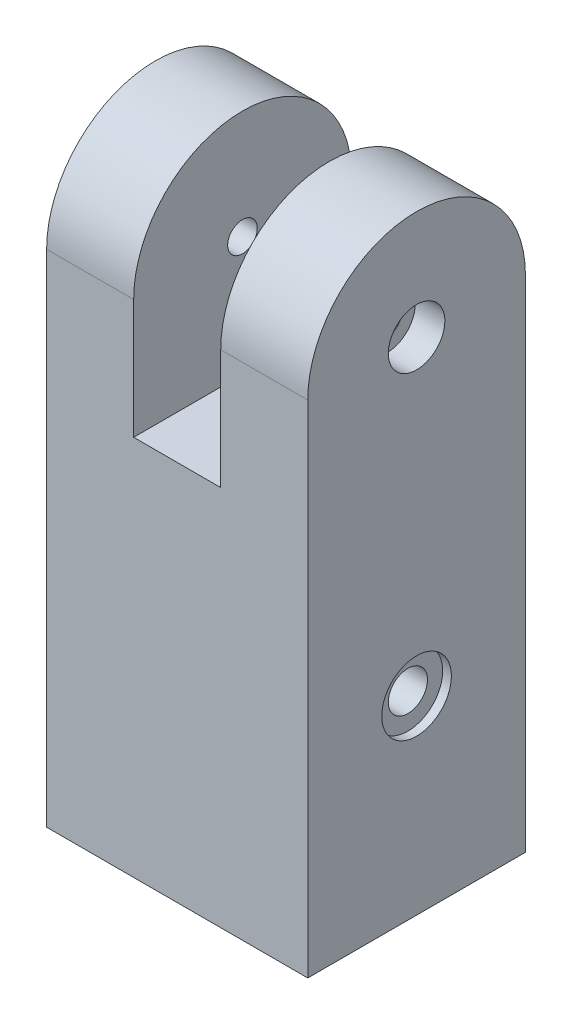
ISO-10303-21;
HEADER;
FILE_DESCRIPTION(('STEP AP214'),'2;1');
FILE_NAME('part.step','',(''),(''),'','','');
FILE_SCHEMA(('AUTOMOTIVE_DESIGN { 1 0 10303 214 1 1 1 1 }'));
ENDSEC;
DATA;
#1=APPLICATION_CONTEXT('core data for automotive mechanical design processes');
#2=APPLICATION_PROTOCOL_DEFINITION('international standard','automotive_design',2000,#1);
#3=PRODUCT_CONTEXT('',#1,'mechanical');
#4=PRODUCT('Part','Part','',(#3));
#5=PRODUCT_RELATED_PRODUCT_CATEGORY('part','',(#4));
#6=PRODUCT_DEFINITION_FORMATION('','',#4);
#7=PRODUCT_DEFINITION_CONTEXT('part definition',#1,'design');
#8=PRODUCT_DEFINITION('design','',#6,#7);
#9=PRODUCT_DEFINITION_SHAPE('','',#8);
#10=(LENGTH_UNIT() NAMED_UNIT(*) SI_UNIT(.MILLI.,.METRE.));
#11=(NAMED_UNIT(*) PLANE_ANGLE_UNIT() SI_UNIT($,.RADIAN.));
#12=(NAMED_UNIT(*) SI_UNIT($,.STERADIAN.) SOLID_ANGLE_UNIT());
#13=UNCERTAINTY_MEASURE_WITH_UNIT(LENGTH_MEASURE(1.E-05),#10,'distance_accuracy_value','');
#14=(GEOMETRIC_REPRESENTATION_CONTEXT(3) GLOBAL_UNCERTAINTY_ASSIGNED_CONTEXT((#13)) GLOBAL_UNIT_ASSIGNED_CONTEXT((#10,
#11,#12)) REPRESENTATION_CONTEXT('',''));
#15=CARTESIAN_POINT('',(0.,0.,0.));
#16=DIRECTION('',(0.,0.,1.));
#17=DIRECTION('',(1.,0.,0.));
#18=AXIS2_PLACEMENT_3D('',#15,#16,#17);
#19=CARTESIAN_POINT('',(15.,17.2001477134217,0.));
#20=DIRECTION('',(-1.,0.,0.));
#21=DIRECTION('',(0.,0.,1.));
#22=AXIS2_PLACEMENT_3D('',#19,#20,#21);
#23=CYLINDRICAL_SURFACE('',#22,12.5);
#24=DIRECTION('',(-1.,0.,0.));
#25=VECTOR('',#24,1.);
#26=CARTESIAN_POINT('',(15.,17.2001477134218,-12.5));
#27=LINE('',#26,#25);
#28=CARTESIAN_POINT('',(15.,17.2001477134218,-12.5));
#29=VERTEX_POINT('',#28);
#30=CARTESIAN_POINT('',(4.99999999999999,17.2001477134218,-12.5));
#31=VERTEX_POINT('',#30);
#32=EDGE_CURVE('E221',#29,#31,#27,.T.);
#33=ORIENTED_EDGE('',*,*,#32,.T.);
#34=CARTESIAN_POINT('',(4.99999999999999,17.2001477134217,0.));
#35=DIRECTION('',(1.,0.,0.));
#36=DIRECTION('',(0.,1.,0.));
#37=AXIS2_PLACEMENT_3D('',#34,#35,#36);
#38=CIRCLE('',#37,12.5);
#39=CARTESIAN_POINT('',(5.,17.2001477134217,12.5));
#40=VERTEX_POINT('',#39);
#41=EDGE_CURVE('E165',#40,#31,#38,.F.);
#42=ORIENTED_EDGE('',*,*,#41,.F.);
#43=DIRECTION('',(-1.,0.,0.));
#44=VECTOR('',#43,1.);
#45=CARTESIAN_POINT('',(15.,17.2001477134217,12.5));
#46=LINE('',#45,#44);
#47=CARTESIAN_POINT('',(15.,17.2001477134217,12.5));
#48=VERTEX_POINT('',#47);
#49=EDGE_CURVE('E12',#48,#40,#46,.T.);
#50=ORIENTED_EDGE('',*,*,#49,.F.);
#51=CARTESIAN_POINT('',(15.,17.2001477134217,0.));
#52=DIRECTION('',(1.,0.,0.));
#53=DIRECTION('',(0.,0.,1.));
#54=AXIS2_PLACEMENT_3D('',#51,#52,#53);
#55=CIRCLE('',#54,12.5);
#56=EDGE_CURVE('E202',#29,#48,#55,.T.);
#57=ORIENTED_EDGE('',*,*,#56,.F.);
#58=EDGE_LOOP('',(#33,#42,#50,#57));
#59=FACE_BOUND('',#58,.T.);
#60=ADVANCED_FACE('F38',(#59),#23,.T.);
#61=CARTESIAN_POINT('',(15.,17.2001477134217,0.));
#62=DIRECTION('',(1.,0.,0.));
#63=DIRECTION('',(0.,0.,-1.));
#64=AXIS2_PLACEMENT_3D('',#61,#62,#63);
#65=CYLINDRICAL_SURFACE('',#64,1.69999999999999);
#66=CARTESIAN_POINT('',(4.99999999999999,17.2001477134217,0.));
#67=DIRECTION('',(1.,0.,0.));
#68=DIRECTION('',(0.,1.,0.));
#69=AXIS2_PLACEMENT_3D('',#66,#67,#68);
#70=CIRCLE('',#69,1.69999999999999);
#71=CARTESIAN_POINT('',(4.99999999999999,18.9001477134217,0.));
#72=VERTEX_POINT('',#71);
#73=EDGE_CURVE('E172',#72,#72,#70,.T.);
#74=ORIENTED_EDGE('',*,*,#73,.F.);
#75=EDGE_LOOP('',(#74));
#76=FACE_BOUND('',#75,.T.);
#77=CARTESIAN_POINT('',(11.6,17.2001477134217,0.));
#78=DIRECTION('',(1.,0.,0.));
#79=DIRECTION('',(0.,0.,-1.));
#80=AXIS2_PLACEMENT_3D('',#77,#78,#79);
#81=CIRCLE('',#80,1.7);
#82=CARTESIAN_POINT('',(11.6,17.2001477134217,-1.7));
#83=VERTEX_POINT('',#82);
#84=EDGE_CURVE('E190',#83,#83,#81,.T.);
#85=ORIENTED_EDGE('',*,*,#84,.T.);
#86=EDGE_LOOP('',(#85));
#87=FACE_BOUND('',#86,.T.);
#88=ADVANCED_FACE('F281',(#76,#87),#65,.F.);
#89=CARTESIAN_POINT('',(-5.,17.2001477134217,12.5));
#90=VERTEX_POINT('',#89);
#91=CARTESIAN_POINT('',(-15.,17.2001477134217,12.5));
#92=VERTEX_POINT('',#91);
#93=EDGE_CURVE('E46',#90,#92,#46,.T.);
#94=ORIENTED_EDGE('',*,*,#93,.F.);
#95=CARTESIAN_POINT('',(-4.99999999999999,17.2001477134217,0.));
#96=DIRECTION('',(-1.,0.,0.));
#97=DIRECTION('',(0.,-1.,0.));
#98=AXIS2_PLACEMENT_3D('',#95,#96,#97);
#99=CIRCLE('',#98,12.5);
#100=CARTESIAN_POINT('',(-4.99999999999999,17.2001477134218,-12.5));
#101=VERTEX_POINT('',#100);
#102=EDGE_CURVE('E162',#101,#90,#99,.F.);
#103=ORIENTED_EDGE('',*,*,#102,.F.);
#104=CARTESIAN_POINT('',(-15.,17.2001477134218,-12.5));
#105=VERTEX_POINT('',#104);
#106=EDGE_CURVE('E212',#101,#105,#27,.T.);
#107=ORIENTED_EDGE('',*,*,#106,.T.);
#108=CARTESIAN_POINT('',(-15.,17.2001477134217,0.));
#109=DIRECTION('',(1.,0.,0.));
#110=DIRECTION('',(0.,0.,1.));
#111=AXIS2_PLACEMENT_3D('',#108,#109,#110);
#112=CIRCLE('',#111,12.5);
#113=EDGE_CURVE('E197',#105,#92,#112,.T.);
#114=ORIENTED_EDGE('',*,*,#113,.T.);
#115=EDGE_LOOP('',(#94,#103,#107,#114));
#116=FACE_BOUND('',#115,.T.);
#117=ADVANCED_FACE('F40',(#116),#23,.T.);
#118=CARTESIAN_POINT('',(15.,-40.2998522865783,12.5));
#119=DIRECTION('',(0.,0.,-1.));
#120=DIRECTION('',(-1.,0.,0.));
#121=AXIS2_PLACEMENT_3D('',#118,#119,#120);
#122=PLANE('',#121);
#123=ORIENTED_EDGE('',*,*,#49,.T.);
#124=DIRECTION('',(0.,1.,0.));
#125=VECTOR('',#124,1.);
#126=CARTESIAN_POINT('',(4.99999999999999,29.7001477134217,12.5));
#127=LINE('',#126,#125);
#128=CARTESIAN_POINT('',(5.,3.49208871633166,12.5));
#129=VERTEX_POINT('',#128);
#130=EDGE_CURVE('E169',#129,#40,#127,.T.);
#131=ORIENTED_EDGE('',*,*,#130,.F.);
#132=DIRECTION('',(1.,0.,0.));
#133=VECTOR('',#132,1.);
#134=CARTESIAN_POINT('',(5.,3.49208871633166,12.5));
#135=LINE('',#134,#133);
#136=CARTESIAN_POINT('',(-5.,3.49208871633166,12.5));
#137=VERTEX_POINT('',#136);
#138=EDGE_CURVE('E185',#137,#129,#135,.T.);
#139=ORIENTED_EDGE('',*,*,#138,.F.);
#140=DIRECTION('',(0.,-1.,0.));
#141=VECTOR('',#140,1.);
#142=CARTESIAN_POINT('',(-4.99999999999999,29.7001477134217,12.5));
#143=LINE('',#142,#141);
#144=EDGE_CURVE('E167',#90,#137,#143,.T.);
#145=ORIENTED_EDGE('',*,*,#144,.F.);
#146=ORIENTED_EDGE('',*,*,#93,.T.);
#147=DIRECTION('',(0.,-1.,0.));
#148=VECTOR('',#147,1.);
#149=CARTESIAN_POINT('',(-15.,-40.2998522865783,12.5));
#150=LINE('',#149,#148);
#151=CARTESIAN_POINT('',(-15.,-40.2998522865783,12.5));
#152=VERTEX_POINT('',#151);
#153=EDGE_CURVE('E215',#92,#152,#150,.T.);
#154=ORIENTED_EDGE('',*,*,#153,.T.);
#155=DIRECTION('',(-1.,0.,0.));
#156=VECTOR('',#155,1.);
#157=CARTESIAN_POINT('',(15.,-40.2998522865783,12.5));
#158=LINE('',#157,#156);
#159=CARTESIAN_POINT('',(15.,-40.2998522865783,12.5));
#160=VERTEX_POINT('',#159);
#161=EDGE_CURVE('E226',#160,#152,#158,.T.);
#162=ORIENTED_EDGE('',*,*,#161,.F.);
#163=DIRECTION('',(0.,-1.,0.));
#164=VECTOR('',#163,1.);
#165=CARTESIAN_POINT('',(15.,-40.2998522865783,12.5));
#166=LINE('',#165,#164);
#167=EDGE_CURVE('E205',#48,#160,#166,.T.);
#168=ORIENTED_EDGE('',*,*,#167,.F.);
#169=EDGE_LOOP('',(#123,#131,#139,#145,#146,#154,#162,#168));
#170=FACE_BOUND('',#169,.T.);
#171=ADVANCED_FACE('F235',(#170),#122,.F.);
#172=CARTESIAN_POINT('',(15.,-40.2998522865783,-12.5));
#173=DIRECTION('',(0.,1.,0.));
#174=DIRECTION('',(0.,0.,1.));
#175=AXIS2_PLACEMENT_3D('',#172,#173,#174);
#176=PLANE('',#175);
#177=DIRECTION('',(-1.,0.,0.));
#178=VECTOR('',#177,1.);
#179=CARTESIAN_POINT('',(-10.2,-40.2998522865783,10.2));
#180=LINE('',#179,#178);
#181=CARTESIAN_POINT('',(10.2,-40.2998522865783,10.2));
#182=VERTEX_POINT('',#181);
#183=CARTESIAN_POINT('',(-10.2,-40.2998522865783,10.2));
#184=VERTEX_POINT('',#183);
#185=EDGE_CURVE('E144',#182,#184,#180,.T.);
#186=ORIENTED_EDGE('',*,*,#185,.F.);
#187=DIRECTION('',(0.,0.,1.));
#188=VECTOR('',#187,1.);
#189=CARTESIAN_POINT('',(10.2,-40.2998522865783,10.2));
#190=LINE('',#189,#188);
#191=CARTESIAN_POINT('',(10.2,-40.2998522865783,-10.2));
#192=VERTEX_POINT('',#191);
#193=EDGE_CURVE('E53',#192,#182,#190,.T.);
#194=ORIENTED_EDGE('',*,*,#193,.F.);
#195=DIRECTION('',(1.,0.,0.));
#196=VECTOR('',#195,1.);
#197=CARTESIAN_POINT('',(-10.2,-40.2998522865783,-10.2));
#198=LINE('',#197,#196);
#199=CARTESIAN_POINT('',(-10.2,-40.2998522865783,-10.2));
#200=VERTEX_POINT('',#199);
#201=EDGE_CURVE('E151',#200,#192,#198,.T.);
#202=ORIENTED_EDGE('',*,*,#201,.F.);
#203=DIRECTION('',(0.,0.,-1.));
#204=VECTOR('',#203,1.);
#205=CARTESIAN_POINT('',(-10.2,-40.2998522865783,10.2));
#206=LINE('',#205,#204);
#207=EDGE_CURVE('E134',#184,#200,#206,.T.);
#208=ORIENTED_EDGE('',*,*,#207,.F.);
#209=EDGE_LOOP('',(#186,#194,#202,#208));
#210=FACE_BOUND('',#209,.T.);
#211=DIRECTION('',(0.,0.,-1.));
#212=VECTOR('',#211,1.);
#213=CARTESIAN_POINT('',(-15.,-40.2998522865783,-12.5));
#214=LINE('',#213,#212);
#215=CARTESIAN_POINT('',(-15.,-40.2998522865783,-12.5));
#216=VERTEX_POINT('',#215);
#217=EDGE_CURVE('E217',#152,#216,#214,.T.);
#218=ORIENTED_EDGE('',*,*,#217,.T.);
#219=DIRECTION('',(-1.,0.,0.));
#220=VECTOR('',#219,1.);
#221=CARTESIAN_POINT('',(15.,-40.2998522865783,-12.5));
#222=LINE('',#221,#220);
#223=CARTESIAN_POINT('',(15.,-40.2998522865783,-12.5));
#224=VERTEX_POINT('',#223);
#225=EDGE_CURVE('E224',#224,#216,#222,.T.);
#226=ORIENTED_EDGE('',*,*,#225,.F.);
#227=DIRECTION('',(0.,0.,-1.));
#228=VECTOR('',#227,1.);
#229=CARTESIAN_POINT('',(15.,-40.2998522865783,-12.5));
#230=LINE('',#229,#228);
#231=EDGE_CURVE('E208',#160,#224,#230,.T.);
#232=ORIENTED_EDGE('',*,*,#231,.F.);
#233=ORIENTED_EDGE('',*,*,#161,.T.);
#234=EDGE_LOOP('',(#218,#226,#232,#233));
#235=FACE_BOUND('',#234,.T.);
#236=ADVANCED_FACE('F148',(#210,#235),#176,.F.);
#237=CARTESIAN_POINT('',(15.,17.2001477134218,-12.5));
#238=DIRECTION('',(0.,0.,1.));
#239=DIRECTION('',(0.,-1.,0.));
#240=AXIS2_PLACEMENT_3D('',#237,#238,#239);
#241=PLANE('',#240);
#242=DIRECTION('',(-1.,0.,0.));
#243=VECTOR('',#242,1.);
#244=CARTESIAN_POINT('',(5.,3.49208871633168,-12.5));
#245=LINE('',#244,#243);
#246=CARTESIAN_POINT('',(5.,3.49208871633168,-12.5));
#247=VERTEX_POINT('',#246);
#248=CARTESIAN_POINT('',(-5.,3.49208871633165,-12.5));
#249=VERTEX_POINT('',#248);
#250=EDGE_CURVE('E61',#247,#249,#245,.T.);
#251=ORIENTED_EDGE('',*,*,#250,.F.);
#252=DIRECTION('',(0.,-1.,0.));
#253=VECTOR('',#252,1.);
#254=CARTESIAN_POINT('',(4.99999999999999,29.7001477134217,-12.5));
#255=LINE('',#254,#253);
#256=EDGE_CURVE('E171',#31,#247,#255,.T.);
#257=ORIENTED_EDGE('',*,*,#256,.F.);
#258=ORIENTED_EDGE('',*,*,#32,.F.);
#259=DIRECTION('',(0.,1.,0.));
#260=VECTOR('',#259,1.);
#261=CARTESIAN_POINT('',(15.,17.2001477134218,-12.5));
#262=LINE('',#261,#260);
#263=EDGE_CURVE('E210',#224,#29,#262,.T.);
#264=ORIENTED_EDGE('',*,*,#263,.F.);
#265=ORIENTED_EDGE('',*,*,#225,.T.);
#266=DIRECTION('',(0.,1.,0.));
#267=VECTOR('',#266,1.);
#268=CARTESIAN_POINT('',(-15.,17.2001477134218,-12.5));
#269=LINE('',#268,#267);
#270=EDGE_CURVE('E206',#216,#105,#269,.T.);
#271=ORIENTED_EDGE('',*,*,#270,.T.);
#272=ORIENTED_EDGE('',*,*,#106,.F.);
#273=DIRECTION('',(0.,1.,0.));
#274=VECTOR('',#273,1.);
#275=CARTESIAN_POINT('',(-4.99999999999999,29.7001477134217,-12.5));
#276=LINE('',#275,#274);
#277=EDGE_CURVE('E180',#249,#101,#276,.T.);
#278=ORIENTED_EDGE('',*,*,#277,.F.);
#279=EDGE_LOOP('',(#251,#257,#258,#264,#265,#271,#272,#278));
#280=FACE_BOUND('',#279,.T.);
#281=ADVANCED_FACE('F246',(#280),#241,.F.);
#282=CARTESIAN_POINT('',(15.,17.2001477134217,0.));
#283=DIRECTION('',(-1.,0.,0.));
#284=DIRECTION('',(0.,0.,1.));
#285=AXIS2_PLACEMENT_3D('',#282,#283,#284);
#286=PLANE('',#285);
#287=CARTESIAN_POINT('',(15.,-18.4950421807972,0.));
#288=DIRECTION('',(1.,0.,0.));
#289=DIRECTION('',(0.,0.,-1.));
#290=AXIS2_PLACEMENT_3D('',#287,#288,#289);
#291=CIRCLE('',#290,4.);
#292=CARTESIAN_POINT('',(15.,-18.4950421807972,-4.));
#293=VERTEX_POINT('',#292);
#294=EDGE_CURVE('E379',#293,#293,#291,.T.);
#295=ORIENTED_EDGE('',*,*,#294,.F.);
#296=EDGE_LOOP('',(#295));
#297=FACE_BOUND('',#296,.T.);
#298=CARTESIAN_POINT('',(15.,17.2001477134217,0.));
#299=DIRECTION('',(1.,0.,0.));
#300=DIRECTION('',(0.,0.,-1.));
#301=AXIS2_PLACEMENT_3D('',#298,#299,#300);
#302=CIRCLE('',#301,3.25);
#303=CARTESIAN_POINT('',(15.,17.2001477134217,-3.25));
#304=VERTEX_POINT('',#303);
#305=EDGE_CURVE('E175',#304,#304,#302,.T.);
#306=ORIENTED_EDGE('',*,*,#305,.F.);
#307=EDGE_LOOP('',(#306));
#308=FACE_BOUND('',#307,.T.);
#309=ORIENTED_EDGE('',*,*,#56,.T.);
#310=ORIENTED_EDGE('',*,*,#167,.T.);
#311=ORIENTED_EDGE('',*,*,#231,.T.);
#312=ORIENTED_EDGE('',*,*,#263,.T.);
#313=EDGE_LOOP('',(#309,#310,#311,#312));
#314=FACE_BOUND('',#313,.T.);
#315=ADVANCED_FACE('F251',(#297,#308,#314),#286,.F.);
#316=CARTESIAN_POINT('',(-15.,17.2001477134217,0.));
#317=DIRECTION('',(-1.,0.,0.));
#318=DIRECTION('',(0.,0.,1.));
#319=AXIS2_PLACEMENT_3D('',#316,#317,#318);
#320=PLANE('',#319);
#321=CARTESIAN_POINT('',(-15.,-18.4950421807972,0.));
#322=DIRECTION('',(-1.,0.,0.));
#323=DIRECTION('',(0.,0.,1.));
#324=AXIS2_PLACEMENT_3D('',#321,#322,#323);
#325=CIRCLE('',#324,4.);
#326=CARTESIAN_POINT('',(-15.,-18.4950421807972,4.));
#327=VERTEX_POINT('',#326);
#328=EDGE_CURVE('E401',#327,#327,#325,.T.);
#329=ORIENTED_EDGE('',*,*,#328,.F.);
#330=EDGE_LOOP('',(#329));
#331=FACE_BOUND('',#330,.T.);
#332=CARTESIAN_POINT('',(-15.,17.2001477134217,0.));
#333=DIRECTION('',(-1.,0.,0.));
#334=DIRECTION('',(0.,0.,1.));
#335=AXIS2_PLACEMENT_3D('',#332,#333,#334);
#336=CIRCLE('',#335,1.69999999999999);
#337=CARTESIAN_POINT('',(-15.,17.2001477134217,1.69999999999999));
#338=VERTEX_POINT('',#337);
#339=EDGE_CURVE('E194',#338,#338,#336,.F.);
#340=ORIENTED_EDGE('',*,*,#339,.T.);
#341=EDGE_LOOP('',(#340));
#342=FACE_BOUND('',#341,.T.);
#343=ORIENTED_EDGE('',*,*,#113,.F.);
#344=ORIENTED_EDGE('',*,*,#270,.F.);
#345=ORIENTED_EDGE('',*,*,#217,.F.);
#346=ORIENTED_EDGE('',*,*,#153,.F.);
#347=EDGE_LOOP('',(#343,#344,#345,#346));
#348=FACE_BOUND('',#347,.T.);
#349=ADVANCED_FACE('F241',(#331,#342,#348),#320,.T.);
#350=CARTESIAN_POINT('',(-4.99999999999999,17.2001477134217,0.));
#351=DIRECTION('',(-1.,0.,0.));
#352=DIRECTION('',(0.,-1.,0.));
#353=AXIS2_PLACEMENT_3D('',#350,#351,#352);
#354=CIRCLE('',#353,1.69999999999999);
#355=CARTESIAN_POINT('',(-4.99999999999999,15.5001477134218,0.));
#356=VERTEX_POINT('',#355);
#357=EDGE_CURVE('E176',#356,#356,#354,.T.);
#358=ORIENTED_EDGE('',*,*,#357,.F.);
#359=EDGE_LOOP('',(#358));
#360=FACE_BOUND('',#359,.T.);
#361=ORIENTED_EDGE('',*,*,#339,.F.);
#362=EDGE_LOOP('',(#361));
#363=FACE_BOUND('',#362,.T.);
#364=ADVANCED_FACE('F287',(#360,#363),#65,.F.);
#365=CARTESIAN_POINT('',(11.6,18.9001477134217,0.));
#366=DIRECTION('',(-1.,0.,0.));
#367=DIRECTION('',(0.,0.,1.));
#368=AXIS2_PLACEMENT_3D('',#365,#366,#367);
#369=PLANE('',#368);
#370=ORIENTED_EDGE('',*,*,#84,.F.);
#371=EDGE_LOOP('',(#370));
#372=FACE_BOUND('',#371,.T.);
#373=CARTESIAN_POINT('',(11.6,17.2001477134217,0.));
#374=DIRECTION('',(1.,0.,0.));
#375=DIRECTION('',(0.,0.,-1.));
#376=AXIS2_PLACEMENT_3D('',#373,#374,#375);
#377=CIRCLE('',#376,3.25);
#378=CARTESIAN_POINT('',(11.6,17.2001477134217,-3.25));
#379=VERTEX_POINT('',#378);
#380=EDGE_CURVE('E193',#379,#379,#377,.T.);
#381=ORIENTED_EDGE('',*,*,#380,.T.);
#382=EDGE_LOOP('',(#381));
#383=FACE_BOUND('',#382,.T.);
#384=ADVANCED_FACE('F275',(#372,#383),#369,.F.);
#385=CARTESIAN_POINT('',(15.,17.2001477134217,0.));
#386=DIRECTION('',(1.,0.,0.));
#387=DIRECTION('',(0.,0.,-1.));
#388=AXIS2_PLACEMENT_3D('',#385,#386,#387);
#389=CYLINDRICAL_SURFACE('',#388,3.25);
#390=ORIENTED_EDGE('',*,*,#380,.F.);
#391=EDGE_LOOP('',(#390));
#392=FACE_BOUND('',#391,.T.);
#393=ORIENTED_EDGE('',*,*,#305,.T.);
#394=EDGE_LOOP('',(#393));
#395=FACE_BOUND('',#394,.T.);
#396=ADVANCED_FACE('F267',(#392,#395),#389,.F.);
#397=CARTESIAN_POINT('',(5.,3.49208871633166,12.501));
#398=DIRECTION('',(0.,-1.,0.));
#399=DIRECTION('',(0.,0.,-1.));
#400=AXIS2_PLACEMENT_3D('',#397,#398,#399);
#401=PLANE('',#400);
#402=CARTESIAN_POINT('',(0.,3.49208871633166,0.));
#403=DIRECTION('',(0.,1.,0.));
#404=DIRECTION('',(0.,0.,1.));
#405=AXIS2_PLACEMENT_3D('',#402,#403,#404);
#406=CIRCLE('',#405,3.99999999999999);
#407=CARTESIAN_POINT('',(0.,3.49208871633166,4.));
#408=VERTEX_POINT('',#407);
#409=EDGE_CURVE('E389',#408,#408,#406,.T.);
#410=ORIENTED_EDGE('',*,*,#409,.F.);
#411=EDGE_LOOP('',(#410));
#412=FACE_BOUND('',#411,.T.);
#413=ORIENTED_EDGE('',*,*,#138,.T.);
#414=DIRECTION('',(0.,0.,-1.));
#415=VECTOR('',#414,1.);
#416=CARTESIAN_POINT('',(5.,3.49208871633166,12.501));
#417=LINE('',#416,#415);
#418=EDGE_CURVE('E182',#129,#247,#417,.T.);
#419=ORIENTED_EDGE('',*,*,#418,.T.);
#420=ORIENTED_EDGE('',*,*,#250,.T.);
#421=DIRECTION('',(0.,0.,-1.));
#422=VECTOR('',#421,1.);
#423=CARTESIAN_POINT('',(-5.,3.49208871633166,12.501));
#424=LINE('',#423,#422);
#425=EDGE_CURVE('E183',#137,#249,#424,.T.);
#426=ORIENTED_EDGE('',*,*,#425,.F.);
#427=EDGE_LOOP('',(#413,#419,#420,#426));
#428=FACE_BOUND('',#427,.T.);
#429=ADVANCED_FACE('F265',(#412,#428),#401,.F.);
#430=CARTESIAN_POINT('',(4.99999999999999,29.7001477134217,12.501));
#431=DIRECTION('',(1.,0.,0.));
#432=DIRECTION('',(0.,1.,0.));
#433=AXIS2_PLACEMENT_3D('',#430,#431,#432);
#434=PLANE('',#433);
#435=ORIENTED_EDGE('',*,*,#41,.T.);
#436=ORIENTED_EDGE('',*,*,#256,.T.);
#437=ORIENTED_EDGE('',*,*,#418,.F.);
#438=ORIENTED_EDGE('',*,*,#130,.T.);
#439=EDGE_LOOP('',(#435,#436,#437,#438));
#440=FACE_BOUND('',#439,.T.);
#441=ORIENTED_EDGE('',*,*,#73,.T.);
#442=EDGE_LOOP('',(#441));
#443=FACE_BOUND('',#442,.T.);
#444=ADVANCED_FACE('F259',(#440,#443),#434,.F.);
#445=CARTESIAN_POINT('',(-4.99999999999999,29.7001477134217,12.501));
#446=DIRECTION('',(-1.,0.,0.));
#447=DIRECTION('',(0.,-1.,0.));
#448=AXIS2_PLACEMENT_3D('',#445,#446,#447);
#449=PLANE('',#448);
#450=ORIENTED_EDGE('',*,*,#102,.T.);
#451=ORIENTED_EDGE('',*,*,#144,.T.);
#452=ORIENTED_EDGE('',*,*,#425,.T.);
#453=ORIENTED_EDGE('',*,*,#277,.T.);
#454=EDGE_LOOP('',(#450,#451,#452,#453));
#455=FACE_BOUND('',#454,.T.);
#456=ORIENTED_EDGE('',*,*,#357,.T.);
#457=EDGE_LOOP('',(#456));
#458=FACE_BOUND('',#457,.T.);
#459=ADVANCED_FACE('F263',(#455,#458),#449,.F.);
#460=CARTESIAN_POINT('',(10.2,32.3420453887428,10.2));
#461=DIRECTION('',(1.,0.,0.));
#462=DIRECTION('',(0.,0.,-1.));
#463=AXIS2_PLACEMENT_3D('',#460,#461,#462);
#464=PLANE('',#463);
#465=CARTESIAN_POINT('',(10.2,-18.4950421807972,0.));
#466=DIRECTION('',(1.,0.,0.));
#467=DIRECTION('',(0.,0.,-1.));
#468=AXIS2_PLACEMENT_3D('',#465,#466,#467);
#469=CIRCLE('',#468,2.25);
#470=CARTESIAN_POINT('',(10.2,-18.4950421807972,-2.25));
#471=VERTEX_POINT('',#470);
#472=EDGE_CURVE('E386',#471,#471,#469,.T.);
#473=ORIENTED_EDGE('',*,*,#472,.T.);
#474=EDGE_LOOP('',(#473));
#475=FACE_BOUND('',#474,.T.);
#476=DIRECTION('',(0.,0.,-1.));
#477=VECTOR('',#476,1.);
#478=CARTESIAN_POINT('',(10.2,-1.50791128366835,10.2));
#479=LINE('',#478,#477);
#480=CARTESIAN_POINT('',(10.2,-1.50791128366835,10.2));
#481=VERTEX_POINT('',#480);
#482=CARTESIAN_POINT('',(10.2,-1.50791128366833,-10.2));
#483=VERTEX_POINT('',#482);
#484=EDGE_CURVE('E163',#481,#483,#479,.T.);
#485=ORIENTED_EDGE('',*,*,#484,.T.);
#486=DIRECTION('',(0.,-1.,0.));
#487=VECTOR('',#486,1.);
#488=CARTESIAN_POINT('',(10.2,32.3420453887428,-10.2));
#489=LINE('',#488,#487);
#490=EDGE_CURVE('E156',#483,#192,#489,.T.);
#491=ORIENTED_EDGE('',*,*,#490,.T.);
#492=ORIENTED_EDGE('',*,*,#193,.T.);
#493=DIRECTION('',(0.,-1.,0.));
#494=VECTOR('',#493,1.);
#495=CARTESIAN_POINT('',(10.2,32.3420453887428,10.2));
#496=LINE('',#495,#494);
#497=EDGE_CURVE('E141',#481,#182,#496,.T.);
#498=ORIENTED_EDGE('',*,*,#497,.F.);
#499=EDGE_LOOP('',(#485,#491,#492,#498));
#500=FACE_BOUND('',#499,.T.);
#501=ADVANCED_FACE('F316',(#475,#500),#464,.F.);
#502=CARTESIAN_POINT('',(-10.2,32.3420453887428,-10.2));
#503=DIRECTION('',(0.,0.,-1.));
#504=DIRECTION('',(0.,1.,0.));
#505=AXIS2_PLACEMENT_3D('',#502,#503,#504);
#506=PLANE('',#505);
#507=DIRECTION('',(-1.,0.,0.));
#508=VECTOR('',#507,1.);
#509=CARTESIAN_POINT('',(-10.2,-1.50791128366833,-10.2));
#510=LINE('',#509,#508);
#511=CARTESIAN_POINT('',(-10.2,-1.50791128366833,-10.2));
#512=VERTEX_POINT('',#511);
#513=EDGE_CURVE('E414',#483,#512,#510,.T.);
#514=ORIENTED_EDGE('',*,*,#513,.T.);
#515=DIRECTION('',(0.,-1.,0.));
#516=VECTOR('',#515,1.);
#517=CARTESIAN_POINT('',(-10.2,32.3420453887428,-10.2));
#518=LINE('',#517,#516);
#519=EDGE_CURVE('E140',#512,#200,#518,.T.);
#520=ORIENTED_EDGE('',*,*,#519,.T.);
#521=ORIENTED_EDGE('',*,*,#201,.T.);
#522=ORIENTED_EDGE('',*,*,#490,.F.);
#523=EDGE_LOOP('',(#514,#520,#521,#522));
#524=FACE_BOUND('',#523,.T.);
#525=ADVANCED_FACE('F320',(#524),#506,.F.);
#526=CARTESIAN_POINT('',(-10.2,32.3420453887428,10.2));
#527=DIRECTION('',(-1.,0.,0.));
#528=DIRECTION('',(0.,0.,1.));
#529=AXIS2_PLACEMENT_3D('',#526,#527,#528);
#530=PLANE('',#529);
#531=CARTESIAN_POINT('',(-10.2,-18.4950421807972,0.));
#532=DIRECTION('',(-1.,0.,0.));
#533=DIRECTION('',(0.,0.,1.));
#534=AXIS2_PLACEMENT_3D('',#531,#532,#533);
#535=CIRCLE('',#534,2.25);
#536=CARTESIAN_POINT('',(-10.2,-18.4950421807972,2.25));
#537=VERTEX_POINT('',#536);
#538=EDGE_CURVE('E410',#537,#537,#535,.T.);
#539=ORIENTED_EDGE('',*,*,#538,.T.);
#540=EDGE_LOOP('',(#539));
#541=FACE_BOUND('',#540,.T.);
#542=DIRECTION('',(0.,0.,1.));
#543=VECTOR('',#542,1.);
#544=CARTESIAN_POINT('',(-10.2,-1.50791128366835,10.2));
#545=LINE('',#544,#543);
#546=CARTESIAN_POINT('',(-10.2,-1.50791128366833,10.2));
#547=VERTEX_POINT('',#546);
#548=EDGE_CURVE('E137',#512,#547,#545,.T.);
#549=ORIENTED_EDGE('',*,*,#548,.T.);
#550=DIRECTION('',(0.,-1.,0.));
#551=VECTOR('',#550,1.);
#552=CARTESIAN_POINT('',(-10.2,32.3420453887428,10.2));
#553=LINE('',#552,#551);
#554=EDGE_CURVE('E129',#547,#184,#553,.T.);
#555=ORIENTED_EDGE('',*,*,#554,.T.);
#556=ORIENTED_EDGE('',*,*,#207,.T.);
#557=ORIENTED_EDGE('',*,*,#519,.F.);
#558=EDGE_LOOP('',(#549,#555,#556,#557));
#559=FACE_BOUND('',#558,.T.);
#560=ADVANCED_FACE('F131',(#541,#559),#530,.F.);
#561=CARTESIAN_POINT('',(-10.2,32.3420453887428,10.2));
#562=DIRECTION('',(0.,0.,1.));
#563=DIRECTION('',(0.,-1.,0.));
#564=AXIS2_PLACEMENT_3D('',#561,#562,#563);
#565=PLANE('',#564);
#566=DIRECTION('',(1.,0.,0.));
#567=VECTOR('',#566,1.);
#568=CARTESIAN_POINT('',(-10.2,-1.50791128366835,10.2));
#569=LINE('',#568,#567);
#570=EDGE_CURVE('E160',#547,#481,#569,.T.);
#571=ORIENTED_EDGE('',*,*,#570,.T.);
#572=ORIENTED_EDGE('',*,*,#497,.T.);
#573=ORIENTED_EDGE('',*,*,#185,.T.);
#574=ORIENTED_EDGE('',*,*,#554,.F.);
#575=EDGE_LOOP('',(#571,#572,#573,#574));
#576=FACE_BOUND('',#575,.T.);
#577=ADVANCED_FACE('F145',(#576),#565,.F.);
#578=CARTESIAN_POINT('',(5.,-1.50791128366835,12.501));
#579=DIRECTION('',(0.,-1.,0.));
#580=DIRECTION('',(0.,0.,-1.));
#581=AXIS2_PLACEMENT_3D('',#578,#579,#580);
#582=PLANE('',#581);
#583=CARTESIAN_POINT('',(0.,-1.50791128366833,0.));
#584=DIRECTION('',(0.,-1.,0.));
#585=DIRECTION('',(0.,0.,-1.));
#586=AXIS2_PLACEMENT_3D('',#583,#584,#585);
#587=CIRCLE('',#586,2.25000000000001);
#588=CARTESIAN_POINT('',(0.,-1.50791128366833,-2.25000000000001));
#589=VERTEX_POINT('',#588);
#590=EDGE_CURVE('E398',#589,#589,#587,.T.);
#591=ORIENTED_EDGE('',*,*,#590,.F.);
#592=EDGE_LOOP('',(#591));
#593=FACE_BOUND('',#592,.T.);
#594=ORIENTED_EDGE('',*,*,#484,.F.);
#595=ORIENTED_EDGE('',*,*,#570,.F.);
#596=ORIENTED_EDGE('',*,*,#548,.F.);
#597=ORIENTED_EDGE('',*,*,#513,.F.);
#598=EDGE_LOOP('',(#594,#595,#596,#597));
#599=FACE_BOUND('',#598,.T.);
#600=ADVANCED_FACE('F326',(#593,#599),#582,.T.);
#601=CARTESIAN_POINT('',(-15.,-18.4950421807972,0.));
#602=DIRECTION('',(-1.,0.,0.));
#603=DIRECTION('',(0.,0.,1.));
#604=AXIS2_PLACEMENT_3D('',#601,#602,#603);
#605=CYLINDRICAL_SURFACE('',#604,2.25);
#606=ORIENTED_EDGE('',*,*,#538,.F.);
#607=EDGE_LOOP('',(#606));
#608=FACE_BOUND('',#607,.T.);
#609=CARTESIAN_POINT('',(-14.,-18.4950421807972,0.));
#610=DIRECTION('',(-1.,0.,0.));
#611=DIRECTION('',(0.,0.,1.));
#612=AXIS2_PLACEMENT_3D('',#609,#610,#611);
#613=CIRCLE('',#612,2.25);
#614=CARTESIAN_POINT('',(-14.,-18.4950421807972,2.25));
#615=VERTEX_POINT('',#614);
#616=EDGE_CURVE('E407',#615,#615,#613,.T.);
#617=ORIENTED_EDGE('',*,*,#616,.T.);
#618=EDGE_LOOP('',(#617));
#619=FACE_BOUND('',#618,.T.);
#620=ADVANCED_FACE('F335',(#608,#619),#605,.F.);
#621=CARTESIAN_POINT('',(-14.,-16.2450421807972,0.));
#622=DIRECTION('',(1.,0.,0.));
#623=DIRECTION('',(0.,0.,-1.));
#624=AXIS2_PLACEMENT_3D('',#621,#622,#623);
#625=PLANE('',#624);
#626=ORIENTED_EDGE('',*,*,#616,.F.);
#627=EDGE_LOOP('',(#626));
#628=FACE_BOUND('',#627,.T.);
#629=CARTESIAN_POINT('',(-14.,-18.4950421807972,0.));
#630=DIRECTION('',(-1.,0.,0.));
#631=DIRECTION('',(0.,0.,1.));
#632=AXIS2_PLACEMENT_3D('',#629,#630,#631);
#633=CIRCLE('',#632,4.);
#634=CARTESIAN_POINT('',(-14.,-18.4950421807972,4.));
#635=VERTEX_POINT('',#634);
#636=EDGE_CURVE('E404',#635,#635,#633,.T.);
#637=ORIENTED_EDGE('',*,*,#636,.T.);
#638=EDGE_LOOP('',(#637));
#639=FACE_BOUND('',#638,.T.);
#640=ADVANCED_FACE('F339',(#628,#639),#625,.F.);
#641=CARTESIAN_POINT('',(-15.,-18.4950421807972,0.));
#642=DIRECTION('',(-1.,0.,0.));
#643=DIRECTION('',(0.,0.,1.));
#644=AXIS2_PLACEMENT_3D('',#641,#642,#643);
#645=CYLINDRICAL_SURFACE('',#644,4.);
#646=ORIENTED_EDGE('',*,*,#636,.F.);
#647=EDGE_LOOP('',(#646));
#648=FACE_BOUND('',#647,.T.);
#649=ORIENTED_EDGE('',*,*,#328,.T.);
#650=EDGE_LOOP('',(#649));
#651=FACE_BOUND('',#650,.T.);
#652=ADVANCED_FACE('F343',(#648,#651),#645,.F.);
#653=CARTESIAN_POINT('',(0.,3.49208871633166,0.));
#654=DIRECTION('',(0.,1.,0.));
#655=DIRECTION('',(0.,0.,1.));
#656=AXIS2_PLACEMENT_3D('',#653,#654,#655);
#657=CYLINDRICAL_SURFACE('',#656,2.25000000000001);
#658=CARTESIAN_POINT('',(0.,-0.907911283668336,0.));
#659=DIRECTION('',(0.,1.,0.));
#660=DIRECTION('',(0.,0.,1.));
#661=AXIS2_PLACEMENT_3D('',#658,#659,#660);
#662=CIRCLE('',#661,2.25000000000001);
#663=CARTESIAN_POINT('',(0.,-0.907911283668338,2.25000000000001));
#664=VERTEX_POINT('',#663);
#665=EDGE_CURVE('E395',#664,#664,#662,.T.);
#666=ORIENTED_EDGE('',*,*,#665,.T.);
#667=EDGE_LOOP('',(#666));
#668=FACE_BOUND('',#667,.T.);
#669=ORIENTED_EDGE('',*,*,#590,.T.);
#670=EDGE_LOOP('',(#669));
#671=FACE_BOUND('',#670,.T.);
#672=ADVANCED_FACE('F347',(#668,#671),#657,.F.);
#673=CARTESIAN_POINT('',(2.25000000000001,-0.907911283668336,0.));
#674=DIRECTION('',(0.,-1.,0.));
#675=DIRECTION('',(0.,0.,-1.));
#676=AXIS2_PLACEMENT_3D('',#673,#674,#675);
#677=PLANE('',#676);
#678=ORIENTED_EDGE('',*,*,#665,.F.);
#679=EDGE_LOOP('',(#678));
#680=FACE_BOUND('',#679,.T.);
#681=CARTESIAN_POINT('',(0.,-0.907911283668336,0.));
#682=DIRECTION('',(0.,1.,0.));
#683=DIRECTION('',(0.,0.,1.));
#684=AXIS2_PLACEMENT_3D('',#681,#682,#683);
#685=CIRCLE('',#684,3.99999999999999);
#686=CARTESIAN_POINT('',(0.,-0.907911283668339,3.99999999999999));
#687=VERTEX_POINT('',#686);
#688=EDGE_CURVE('E392',#687,#687,#685,.T.);
#689=ORIENTED_EDGE('',*,*,#688,.T.);
#690=EDGE_LOOP('',(#689));
#691=FACE_BOUND('',#690,.T.);
#692=ADVANCED_FACE('F351',(#680,#691),#677,.F.);
#693=CARTESIAN_POINT('',(0.,3.49208871633166,0.));
#694=DIRECTION('',(0.,1.,0.));
#695=DIRECTION('',(0.,0.,1.));
#696=AXIS2_PLACEMENT_3D('',#693,#694,#695);
#697=CYLINDRICAL_SURFACE('',#696,3.99999999999999);
#698=ORIENTED_EDGE('',*,*,#688,.F.);
#699=EDGE_LOOP('',(#698));
#700=FACE_BOUND('',#699,.T.);
#701=ORIENTED_EDGE('',*,*,#409,.T.);
#702=EDGE_LOOP('',(#701));
#703=FACE_BOUND('',#702,.T.);
#704=ADVANCED_FACE('F355',(#700,#703),#697,.F.);
#705=CARTESIAN_POINT('',(15.,-18.4950421807972,0.));
#706=DIRECTION('',(1.,0.,0.));
#707=DIRECTION('',(0.,0.,-1.));
#708=AXIS2_PLACEMENT_3D('',#705,#706,#707);
#709=CYLINDRICAL_SURFACE('',#708,2.25);
#710=ORIENTED_EDGE('',*,*,#472,.F.);
#711=EDGE_LOOP('',(#710));
#712=FACE_BOUND('',#711,.T.);
#713=CARTESIAN_POINT('',(14.,-18.4950421807972,0.));
#714=DIRECTION('',(1.,0.,0.));
#715=DIRECTION('',(0.,0.,-1.));
#716=AXIS2_PLACEMENT_3D('',#713,#714,#715);
#717=CIRCLE('',#716,2.25);
#718=CARTESIAN_POINT('',(14.,-18.4950421807972,-2.25));
#719=VERTEX_POINT('',#718);
#720=EDGE_CURVE('E381',#719,#719,#717,.T.);
#721=ORIENTED_EDGE('',*,*,#720,.T.);
#722=EDGE_LOOP('',(#721));
#723=FACE_BOUND('',#722,.T.);
#724=ADVANCED_FACE('F359',(#712,#723),#709,.F.);
#725=CARTESIAN_POINT('',(14.,-16.2450421807972,0.));
#726=DIRECTION('',(-1.,0.,0.));
#727=DIRECTION('',(0.,0.,1.));
#728=AXIS2_PLACEMENT_3D('',#725,#726,#727);
#729=PLANE('',#728);
#730=ORIENTED_EDGE('',*,*,#720,.F.);
#731=EDGE_LOOP('',(#730));
#732=FACE_BOUND('',#731,.T.);
#733=CARTESIAN_POINT('',(14.,-18.4950421807972,0.));
#734=DIRECTION('',(1.,0.,0.));
#735=DIRECTION('',(0.,0.,-1.));
#736=AXIS2_PLACEMENT_3D('',#733,#734,#735);
#737=CIRCLE('',#736,4.);
#738=CARTESIAN_POINT('',(14.,-18.4950421807972,-4.));
#739=VERTEX_POINT('',#738);
#740=EDGE_CURVE('E376',#739,#739,#737,.T.);
#741=ORIENTED_EDGE('',*,*,#740,.T.);
#742=EDGE_LOOP('',(#741));
#743=FACE_BOUND('',#742,.T.);
#744=ADVANCED_FACE('F363',(#732,#743),#729,.F.);
#745=CARTESIAN_POINT('',(15.,-18.4950421807972,0.));
#746=DIRECTION('',(1.,0.,0.));
#747=DIRECTION('',(0.,0.,-1.));
#748=AXIS2_PLACEMENT_3D('',#745,#746,#747);
#749=CYLINDRICAL_SURFACE('',#748,4.);
#750=ORIENTED_EDGE('',*,*,#740,.F.);
#751=EDGE_LOOP('',(#750));
#752=FACE_BOUND('',#751,.T.);
#753=ORIENTED_EDGE('',*,*,#294,.T.);
#754=EDGE_LOOP('',(#753));
#755=FACE_BOUND('',#754,.T.);
#756=ADVANCED_FACE('F367',(#752,#755),#749,.F.);
#757=CLOSED_SHELL('',(#60,#88,#117,#171,#236,#281,#315,#349,#364,#384,#396,#429,#444,#459,#501,
#525,#560,#577,#600,#620,#640,#652,#672,#692,#704,#724,#744,#756));
#758=MANIFOLD_SOLID_BREP('B2',#757);
#759=ADVANCED_BREP_SHAPE_REPRESENTATION('',(#18,#758),#14);
#760=SHAPE_DEFINITION_REPRESENTATION(#9,#759);
ENDSEC;
END-ISO-10303-21;
